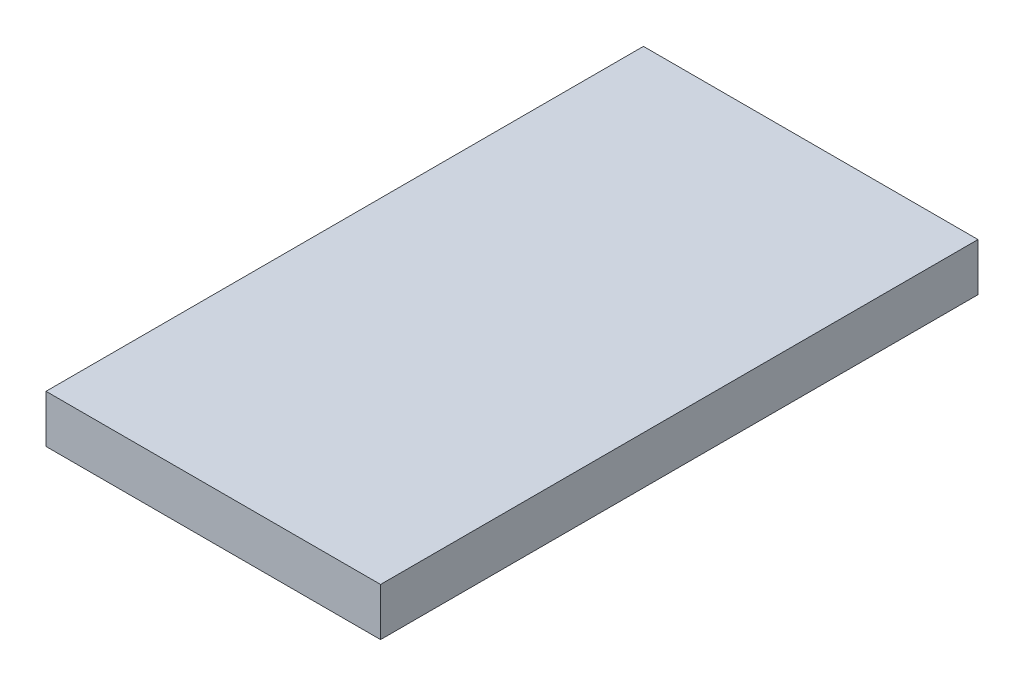
ISO-10303-21;
HEADER;
FILE_DESCRIPTION(('STEP AP214'),'2;1');
FILE_NAME('part.step','',(''),(''),'','','');
FILE_SCHEMA(('AUTOMOTIVE_DESIGN { 1 0 10303 214 1 1 1 1 }'));
ENDSEC;
DATA;
#1=APPLICATION_CONTEXT('core data for automotive mechanical design processes');
#2=APPLICATION_PROTOCOL_DEFINITION('international standard','automotive_design',2000,#1);
#3=PRODUCT_CONTEXT('',#1,'mechanical');
#4=PRODUCT('Part','Part','',(#3));
#5=PRODUCT_RELATED_PRODUCT_CATEGORY('part','',(#4));
#6=PRODUCT_DEFINITION_FORMATION('','',#4);
#7=PRODUCT_DEFINITION_CONTEXT('part definition',#1,'design');
#8=PRODUCT_DEFINITION('design','',#6,#7);
#9=PRODUCT_DEFINITION_SHAPE('','',#8);
#10=(LENGTH_UNIT() NAMED_UNIT(*) SI_UNIT(.MILLI.,.METRE.));
#11=(NAMED_UNIT(*) PLANE_ANGLE_UNIT() SI_UNIT($,.RADIAN.));
#12=(NAMED_UNIT(*) SI_UNIT($,.STERADIAN.) SOLID_ANGLE_UNIT());
#13=UNCERTAINTY_MEASURE_WITH_UNIT(LENGTH_MEASURE(1.E-05),#10,'distance_accuracy_value','');
#14=(GEOMETRIC_REPRESENTATION_CONTEXT(3) GLOBAL_UNCERTAINTY_ASSIGNED_CONTEXT((#13)) GLOBAL_UNIT_ASSIGNED_CONTEXT((#10,
#11,#12)) REPRESENTATION_CONTEXT('',''));
#15=CARTESIAN_POINT('',(0.,0.,0.));
#16=DIRECTION('',(0.,0.,1.));
#17=DIRECTION('',(1.,0.,0.));
#18=AXIS2_PLACEMENT_3D('',#15,#16,#17);
#19=CARTESIAN_POINT('',(0.,6.35,0.));
#20=DIRECTION('',(1.,0.,0.));
#21=DIRECTION('',(0.,0.,-1.));
#22=AXIS2_PLACEMENT_3D('',#19,#20,#21);
#23=PLANE('',#22);
#24=DIRECTION('',(0.,0.,1.));
#25=VECTOR('',#24,1.);
#26=CARTESIAN_POINT('',(0.,0.,0.));
#27=LINE('',#26,#25);
#28=CARTESIAN_POINT('',(0.,0.,-79.375));
#29=VERTEX_POINT('',#28);
#30=CARTESIAN_POINT('',(0.,0.,0.));
#31=VERTEX_POINT('',#30);
#32=EDGE_CURVE('E96',#29,#31,#27,.T.);
#33=ORIENTED_EDGE('',*,*,#32,.T.);
#34=DIRECTION('',(0.,-1.,0.));
#35=VECTOR('',#34,1.);
#36=CARTESIAN_POINT('',(0.,6.35,0.));
#37=LINE('',#36,#35);
#38=CARTESIAN_POINT('',(0.,6.35,0.));
#39=VERTEX_POINT('',#38);
#40=EDGE_CURVE('E11',#39,#31,#37,.T.);
#41=ORIENTED_EDGE('',*,*,#40,.F.);
#42=DIRECTION('',(0.,0.,1.));
#43=VECTOR('',#42,1.);
#44=CARTESIAN_POINT('',(0.,6.35,0.));
#45=LINE('',#44,#43);
#46=CARTESIAN_POINT('',(0.,6.35,-79.375));
#47=VERTEX_POINT('',#46);
#48=EDGE_CURVE('E84',#47,#39,#45,.T.);
#49=ORIENTED_EDGE('',*,*,#48,.F.);
#50=DIRECTION('',(0.,-1.,0.));
#51=VECTOR('',#50,1.);
#52=CARTESIAN_POINT('',(0.,6.35,-79.375));
#53=LINE('',#52,#51);
#54=EDGE_CURVE('E92',#47,#29,#53,.T.);
#55=ORIENTED_EDGE('',*,*,#54,.T.);
#56=EDGE_LOOP('',(#33,#41,#49,#55));
#57=FACE_BOUND('',#56,.T.);
#58=ADVANCED_FACE('F33',(#57),#23,.F.);
#59=CARTESIAN_POINT('',(0.,6.35,0.));
#60=DIRECTION('',(0.,0.,-1.));
#61=DIRECTION('',(-1.,0.,0.));
#62=AXIS2_PLACEMENT_3D('',#59,#60,#61);
#63=PLANE('',#62);
#64=DIRECTION('',(1.,0.,0.));
#65=VECTOR('',#64,1.);
#66=CARTESIAN_POINT('',(0.,0.,0.));
#67=LINE('',#66,#65);
#68=CARTESIAN_POINT('',(44.45,0.,0.));
#69=VERTEX_POINT('',#68);
#70=EDGE_CURVE('E88',#31,#69,#67,.T.);
#71=ORIENTED_EDGE('',*,*,#70,.T.);
#72=DIRECTION('',(0.,-1.,0.));
#73=VECTOR('',#72,1.);
#74=CARTESIAN_POINT('',(44.45,6.35,0.));
#75=LINE('',#74,#73);
#76=CARTESIAN_POINT('',(44.45,6.35,0.));
#77=VERTEX_POINT('',#76);
#78=EDGE_CURVE('E41',#77,#69,#75,.T.);
#79=ORIENTED_EDGE('',*,*,#78,.F.);
#80=DIRECTION('',(1.,0.,0.));
#81=VECTOR('',#80,1.);
#82=CARTESIAN_POINT('',(0.,6.35,0.));
#83=LINE('',#82,#81);
#84=EDGE_CURVE('E79',#39,#77,#83,.T.);
#85=ORIENTED_EDGE('',*,*,#84,.F.);
#86=ORIENTED_EDGE('',*,*,#40,.T.);
#87=EDGE_LOOP('',(#71,#79,#85,#86));
#88=FACE_BOUND('',#87,.T.);
#89=ADVANCED_FACE('F87',(#88),#63,.F.);
#90=CARTESIAN_POINT('',(44.45,6.35,0.));
#91=DIRECTION('',(-1.,0.,0.));
#92=DIRECTION('',(0.,0.,1.));
#93=AXIS2_PLACEMENT_3D('',#90,#91,#92);
#94=PLANE('',#93);
#95=DIRECTION('',(0.,0.,-1.));
#96=VECTOR('',#95,1.);
#97=CARTESIAN_POINT('',(44.45,0.,0.));
#98=LINE('',#97,#96);
#99=CARTESIAN_POINT('',(44.45,0.,-79.375));
#100=VERTEX_POINT('',#99);
#101=EDGE_CURVE('E66',#69,#100,#98,.T.);
#102=ORIENTED_EDGE('',*,*,#101,.T.);
#103=DIRECTION('',(0.,-1.,0.));
#104=VECTOR('',#103,1.);
#105=CARTESIAN_POINT('',(44.45,6.35,-79.375));
#106=LINE('',#105,#104);
#107=CARTESIAN_POINT('',(44.45,6.35,-79.375));
#108=VERTEX_POINT('',#107);
#109=EDGE_CURVE('E89',#108,#100,#106,.T.);
#110=ORIENTED_EDGE('',*,*,#109,.F.);
#111=DIRECTION('',(0.,0.,-1.));
#112=VECTOR('',#111,1.);
#113=CARTESIAN_POINT('',(44.45,6.35,0.));
#114=LINE('',#113,#112);
#115=EDGE_CURVE('E82',#77,#108,#114,.T.);
#116=ORIENTED_EDGE('',*,*,#115,.F.);
#117=ORIENTED_EDGE('',*,*,#78,.T.);
#118=EDGE_LOOP('',(#102,#110,#116,#117));
#119=FACE_BOUND('',#118,.T.);
#120=ADVANCED_FACE('F90',(#119),#94,.F.);
#121=CARTESIAN_POINT('',(0.,6.35,-79.375));
#122=DIRECTION('',(0.,0.,1.));
#123=DIRECTION('',(1.,0.,0.));
#124=AXIS2_PLACEMENT_3D('',#121,#122,#123);
#125=PLANE('',#124);
#126=DIRECTION('',(-1.,0.,0.));
#127=VECTOR('',#126,1.);
#128=CARTESIAN_POINT('',(0.,0.,-79.375));
#129=LINE('',#128,#127);
#130=EDGE_CURVE('E72',#100,#29,#129,.T.);
#131=ORIENTED_EDGE('',*,*,#130,.T.);
#132=ORIENTED_EDGE('',*,*,#54,.F.);
#133=DIRECTION('',(-1.,0.,0.));
#134=VECTOR('',#133,1.);
#135=CARTESIAN_POINT('',(0.,6.35,-79.375));
#136=LINE('',#135,#134);
#137=EDGE_CURVE('E49',#108,#47,#136,.T.);
#138=ORIENTED_EDGE('',*,*,#137,.F.);
#139=ORIENTED_EDGE('',*,*,#109,.T.);
#140=EDGE_LOOP('',(#131,#132,#138,#139));
#141=FACE_BOUND('',#140,.T.);
#142=ADVANCED_FACE('F103',(#141),#125,.F.);
#143=CARTESIAN_POINT('',(0.,6.35,0.));
#144=DIRECTION('',(0.,-1.,0.));
#145=DIRECTION('',(0.,0.,-1.));
#146=AXIS2_PLACEMENT_3D('',#143,#144,#145);
#147=PLANE('',#146);
#148=ORIENTED_EDGE('',*,*,#48,.T.);
#149=ORIENTED_EDGE('',*,*,#84,.T.);
#150=ORIENTED_EDGE('',*,*,#115,.T.);
#151=ORIENTED_EDGE('',*,*,#137,.T.);
#152=EDGE_LOOP('',(#148,#149,#150,#151));
#153=FACE_BOUND('',#152,.T.);
#154=ADVANCED_FACE('F80',(#153),#147,.F.);
#155=CARTESIAN_POINT('',(0.,0.,0.));
#156=DIRECTION('',(0.,-1.,0.));
#157=DIRECTION('',(0.,0.,-1.));
#158=AXIS2_PLACEMENT_3D('',#155,#156,#157);
#159=PLANE('',#158);
#160=ORIENTED_EDGE('',*,*,#32,.F.);
#161=ORIENTED_EDGE('',*,*,#130,.F.);
#162=ORIENTED_EDGE('',*,*,#101,.F.);
#163=ORIENTED_EDGE('',*,*,#70,.F.);
#164=EDGE_LOOP('',(#160,#161,#162,#163));
#165=FACE_BOUND('',#164,.T.);
#166=ADVANCED_FACE('F106',(#165),#159,.T.);
#167=CLOSED_SHELL('',(#58,#89,#120,#142,#154,#166));
#168=MANIFOLD_SOLID_BREP('B2',#167);
#169=ADVANCED_BREP_SHAPE_REPRESENTATION('',(#18,#168),#14);
#170=SHAPE_DEFINITION_REPRESENTATION(#9,#169);
ENDSEC;
END-ISO-10303-21;
